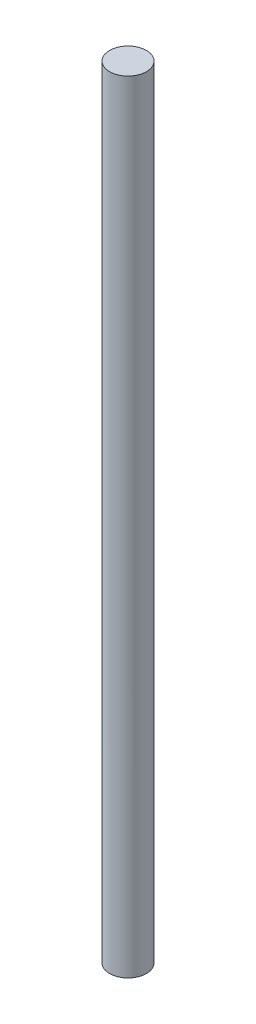
ISO-10303-21;
HEADER;
FILE_DESCRIPTION(('STEP AP214'),'2;1');
FILE_NAME('part.step','',(''),(''),'','','');
FILE_SCHEMA(('AUTOMOTIVE_DESIGN { 1 0 10303 214 1 1 1 1 }'));
ENDSEC;
DATA;
#1=APPLICATION_CONTEXT('core data for automotive mechanical design processes');
#2=APPLICATION_PROTOCOL_DEFINITION('international standard','automotive_design',2000,#1);
#3=PRODUCT_CONTEXT('',#1,'mechanical');
#4=PRODUCT('Part','Part','',(#3));
#5=PRODUCT_RELATED_PRODUCT_CATEGORY('part','',(#4));
#6=PRODUCT_DEFINITION_FORMATION('','',#4);
#7=PRODUCT_DEFINITION_CONTEXT('part definition',#1,'design');
#8=PRODUCT_DEFINITION('design','',#6,#7);
#9=PRODUCT_DEFINITION_SHAPE('','',#8);
#10=(LENGTH_UNIT() NAMED_UNIT(*) SI_UNIT(.MILLI.,.METRE.));
#11=(NAMED_UNIT(*) PLANE_ANGLE_UNIT() SI_UNIT($,.RADIAN.));
#12=(NAMED_UNIT(*) SI_UNIT($,.STERADIAN.) SOLID_ANGLE_UNIT());
#13=UNCERTAINTY_MEASURE_WITH_UNIT(LENGTH_MEASURE(1.E-05),#10,'distance_accuracy_value','');
#14=(GEOMETRIC_REPRESENTATION_CONTEXT(3) GLOBAL_UNCERTAINTY_ASSIGNED_CONTEXT((#13)) GLOBAL_UNIT_ASSIGNED_CONTEXT((#10,
#11,#12)) REPRESENTATION_CONTEXT('',''));
#15=CARTESIAN_POINT('',(0.,0.,0.));
#16=DIRECTION('',(0.,0.,1.));
#17=DIRECTION('',(1.,0.,0.));
#18=AXIS2_PLACEMENT_3D('',#15,#16,#17);
#19=CARTESIAN_POINT('',(0.,312.485805347124,0.));
#20=DIRECTION('',(0.,-1.,0.));
#21=DIRECTION('',(0.,0.,-1.));
#22=AXIS2_PLACEMENT_3D('',#19,#20,#21);
#23=CYLINDRICAL_SURFACE('',#22,6.35);
#24=CARTESIAN_POINT('',(0.,294.525293104986,0.));
#25=DIRECTION('',(0.,-1.,0.));
#26=DIRECTION('',(0.,0.,-1.));
#27=AXIS2_PLACEMENT_3D('',#24,#25,#26);
#28=CIRCLE('',#27,6.35);
#29=CARTESIAN_POINT('',(0.,294.525293104986,-6.35000000000001));
#30=VERTEX_POINT('',#29);
#31=EDGE_CURVE('E10',#30,#30,#28,.T.);
#32=ORIENTED_EDGE('',*,*,#31,.T.);
#33=EDGE_LOOP('',(#32));
#34=FACE_BOUND('',#33,.T.);
#35=CARTESIAN_POINT('',(0.,25.4,0.));
#36=DIRECTION('',(0.,1.,0.));
#37=DIRECTION('',(0.,0.,1.));
#38=AXIS2_PLACEMENT_3D('',#35,#36,#37);
#39=CIRCLE('',#38,6.35);
#40=CARTESIAN_POINT('',(0.,25.4,6.35));
#41=VERTEX_POINT('',#40);
#42=EDGE_CURVE('E39',#41,#41,#39,.F.);
#43=ORIENTED_EDGE('',*,*,#42,.F.);
#44=EDGE_LOOP('',(#43));
#45=FACE_BOUND('',#44,.T.);
#46=ADVANCED_FACE('F33',(#34,#45),#23,.T.);
#47=CARTESIAN_POINT('',(-1.04776173574431E-13,294.525293104986,0.));
#48=DIRECTION('',(0.,-1.,0.));
#49=DIRECTION('',(-0.872328749131666,0.,-0.488919782212158));
#50=AXIS2_PLACEMENT_3D('',#47,#48,#49);
#51=PLANE('',#50);
#52=ORIENTED_EDGE('',*,*,#31,.F.);
#53=EDGE_LOOP('',(#52));
#54=FACE_BOUND('',#53,.T.);
#55=ADVANCED_FACE('F48',(#54),#51,.F.);
#56=CARTESIAN_POINT('',(-1.09927090089231E-13,25.4,0.));
#57=DIRECTION('',(0.,1.,0.));
#58=DIRECTION('',(0.9068500287553,0.,-0.421453467593412));
#59=AXIS2_PLACEMENT_3D('',#56,#57,#58);
#60=PLANE('',#59);
#61=ORIENTED_EDGE('',*,*,#42,.T.);
#62=EDGE_LOOP('',(#61));
#63=FACE_BOUND('',#62,.T.);
#64=ADVANCED_FACE('F45',(#63),#60,.F.);
#65=CLOSED_SHELL('',(#46,#55,#64));
#66=MANIFOLD_SOLID_BREP('B2',#65);
#67=ADVANCED_BREP_SHAPE_REPRESENTATION('',(#18,#66),#14);
#68=SHAPE_DEFINITION_REPRESENTATION(#9,#67);
ENDSEC;
END-ISO-10303-21;
